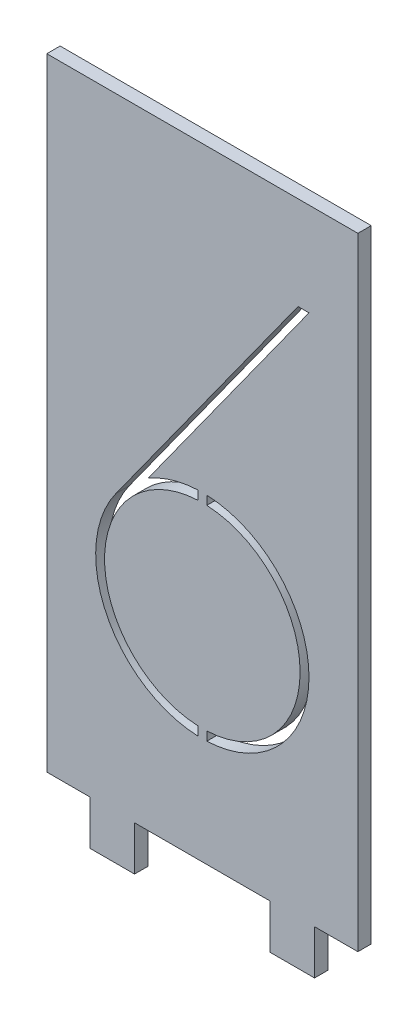
ISO-10303-21;
HEADER;
FILE_DESCRIPTION(('STEP AP214'),'2;1');
FILE_NAME('part.step','',(''),(''),'','','');
FILE_SCHEMA(('AUTOMOTIVE_DESIGN { 1 0 10303 214 1 1 1 1 }'));
ENDSEC;
DATA;
#1=APPLICATION_CONTEXT('core data for automotive mechanical design processes');
#2=APPLICATION_PROTOCOL_DEFINITION('international standard','automotive_design',2000,#1);
#3=PRODUCT_CONTEXT('',#1,'mechanical');
#4=PRODUCT('Part','Part','',(#3));
#5=PRODUCT_RELATED_PRODUCT_CATEGORY('part','',(#4));
#6=PRODUCT_DEFINITION_FORMATION('','',#4);
#7=PRODUCT_DEFINITION_CONTEXT('part definition',#1,'design');
#8=PRODUCT_DEFINITION('design','',#6,#7);
#9=PRODUCT_DEFINITION_SHAPE('','',#8);
#10=(LENGTH_UNIT() NAMED_UNIT(*) SI_UNIT(.MILLI.,.METRE.));
#11=(NAMED_UNIT(*) PLANE_ANGLE_UNIT() SI_UNIT($,.RADIAN.));
#12=(NAMED_UNIT(*) SI_UNIT($,.STERADIAN.) SOLID_ANGLE_UNIT());
#13=UNCERTAINTY_MEASURE_WITH_UNIT(LENGTH_MEASURE(1.E-05),#10,'distance_accuracy_value','');
#14=(GEOMETRIC_REPRESENTATION_CONTEXT(3) GLOBAL_UNCERTAINTY_ASSIGNED_CONTEXT((#13)) GLOBAL_UNIT_ASSIGNED_CONTEXT((#10,
#11,#12)) REPRESENTATION_CONTEXT('',''));
#15=CARTESIAN_POINT('',(0.,0.,0.));
#16=DIRECTION('',(0.,0.,1.));
#17=DIRECTION('',(1.,0.,0.));
#18=AXIS2_PLACEMENT_3D('',#15,#16,#17);
#19=CARTESIAN_POINT('',(17.,42.6431760717279,0.));
#20=DIRECTION('',(-1.,0.,0.));
#21=DIRECTION('',(0.,-1.,0.));
#22=AXIS2_PLACEMENT_3D('',#19,#20,#21);
#23=PLANE('',#22);
#24=DIRECTION('',(0.,0.,1.));
#25=VECTOR('',#24,1.);
#26=CARTESIAN_POINT('',(17.,18.011369512082,0.));
#27=LINE('',#26,#25);
#28=CARTESIAN_POINT('',(17.,18.011369512082,0.));
#29=VERTEX_POINT('',#28);
#30=CARTESIAN_POINT('',(17.,18.0113695120821,1.5));
#31=VERTEX_POINT('',#30);
#32=EDGE_CURVE('E237',#29,#31,#27,.T.);
#33=ORIENTED_EDGE('',*,*,#32,.F.);
#34=DIRECTION('',(0.,-1.,0.));
#35=VECTOR('',#34,1.);
#36=CARTESIAN_POINT('',(17.,42.6431760717279,0.));
#37=LINE('',#36,#35);
#38=CARTESIAN_POINT('',(17.,17.0104211917182,0.));
#39=VERTEX_POINT('',#38);
#40=EDGE_CURVE('E232',#29,#39,#37,.T.);
#41=ORIENTED_EDGE('',*,*,#40,.T.);
#42=DIRECTION('',(0.,0.,1.));
#43=VECTOR('',#42,1.);
#44=CARTESIAN_POINT('',(17.,17.0104211917182,0.));
#45=LINE('',#44,#43);
#46=CARTESIAN_POINT('',(17.,17.0104211917182,1.5));
#47=VERTEX_POINT('',#46);
#48=EDGE_CURVE('E396',#47,#39,#45,.F.);
#49=ORIENTED_EDGE('',*,*,#48,.F.);
#50=DIRECTION('',(0.,-1.,0.));
#51=VECTOR('',#50,1.);
#52=CARTESIAN_POINT('',(17.,42.6431760717279,1.5));
#53=LINE('',#52,#51);
#54=EDGE_CURVE('E260',#31,#47,#53,.T.);
#55=ORIENTED_EDGE('',*,*,#54,.F.);
#56=EDGE_LOOP('',(#33,#41,#49,#55));
#57=FACE_BOUND('',#56,.T.);
#58=ADVANCED_FACE('F38',(#57),#23,.T.);
#59=CARTESIAN_POINT('',(18.,42.6431760717279,0.));
#60=DIRECTION('',(1.,0.,0.));
#61=DIRECTION('',(0.,1.,0.));
#62=AXIS2_PLACEMENT_3D('',#59,#60,#61);
#63=PLANE('',#62);
#64=DIRECTION('',(0.,0.,1.));
#65=VECTOR('',#64,1.);
#66=CARTESIAN_POINT('',(18.,39.988630487918,0.));
#67=LINE('',#66,#65);
#68=CARTESIAN_POINT('',(18.,39.988630487918,0.));
#69=VERTEX_POINT('',#68);
#70=CARTESIAN_POINT('',(18.,39.988630487918,1.5));
#71=VERTEX_POINT('',#70);
#72=EDGE_CURVE('E11',#69,#71,#67,.T.);
#73=ORIENTED_EDGE('',*,*,#72,.F.);
#74=DIRECTION('',(0.,1.,0.));
#75=VECTOR('',#74,1.);
#76=CARTESIAN_POINT('',(18.,42.6431760717279,0.));
#77=LINE('',#76,#75);
#78=CARTESIAN_POINT('',(18.,40.9895788082818,0.));
#79=VERTEX_POINT('',#78);
#80=EDGE_CURVE('E410',#69,#79,#77,.T.);
#81=ORIENTED_EDGE('',*,*,#80,.T.);
#82=DIRECTION('',(0.,0.,1.));
#83=VECTOR('',#82,1.);
#84=CARTESIAN_POINT('',(18.,40.9895788082818,0.));
#85=LINE('',#84,#83);
#86=CARTESIAN_POINT('',(18.,40.9895788082818,1.5));
#87=VERTEX_POINT('',#86);
#88=EDGE_CURVE('E391',#87,#79,#85,.F.);
#89=ORIENTED_EDGE('',*,*,#88,.F.);
#90=DIRECTION('',(0.,1.,0.));
#91=VECTOR('',#90,1.);
#92=CARTESIAN_POINT('',(18.,42.6431760717279,1.5));
#93=LINE('',#92,#91);
#94=EDGE_CURVE('E259',#71,#87,#93,.T.);
#95=ORIENTED_EDGE('',*,*,#94,.F.);
#96=EDGE_LOOP('',(#73,#81,#89,#95));
#97=FACE_BOUND('',#96,.T.);
#98=ADVANCED_FACE('F441',(#97),#63,.T.);
#99=CARTESIAN_POINT('',(17.5,29.,0.));
#100=DIRECTION('',(0.,0.,1.));
#101=DIRECTION('',(1.,0.,0.));
#102=AXIS2_PLACEMENT_3D('',#99,#100,#101);
#103=CYLINDRICAL_SURFACE('',#102,12.);
#104=CARTESIAN_POINT('',(17.5,29.,0.));
#105=DIRECTION('',(0.,0.,1.));
#106=DIRECTION('',(1.,0.,0.));
#107=AXIS2_PLACEMENT_3D('',#104,#105,#106);
#108=CIRCLE('',#107,12.);
#109=CARTESIAN_POINT('',(17.,40.9895788082818,0.));
#110=VERTEX_POINT('',#109);
#111=CARTESIAN_POINT('',(11.39514276269,39.3310560017873,0.));
#112=VERTEX_POINT('',#111);
#113=EDGE_CURVE('E353',#110,#112,#108,.T.);
#114=ORIENTED_EDGE('',*,*,#113,.F.);
#115=DIRECTION('',(0.,0.,1.));
#116=VECTOR('',#115,1.);
#117=CARTESIAN_POINT('',(17.,40.9895788082818,0.));
#118=LINE('',#117,#116);
#119=CARTESIAN_POINT('',(17.,40.9895788082818,1.5));
#120=VERTEX_POINT('',#119);
#121=EDGE_CURVE('E394',#110,#120,#118,.T.);
#122=ORIENTED_EDGE('',*,*,#121,.T.);
#123=CARTESIAN_POINT('',(17.5,29.,1.5));
#124=DIRECTION('',(0.,0.,1.));
#125=DIRECTION('',(1.,0.,0.));
#126=AXIS2_PLACEMENT_3D('',#123,#124,#125);
#127=CIRCLE('',#126,12.);
#128=CARTESIAN_POINT('',(11.39514276269,39.3310560017873,1.5));
#129=VERTEX_POINT('',#128);
#130=EDGE_CURVE('E257',#120,#129,#127,.T.);
#131=ORIENTED_EDGE('',*,*,#130,.T.);
#132=DIRECTION('',(0.,0.,1.));
#133=VECTOR('',#132,1.);
#134=CARTESIAN_POINT('',(11.3951427626901,39.3310560017873,0.));
#135=LINE('',#134,#133);
#136=EDGE_CURVE('E382',#129,#112,#135,.F.);
#137=ORIENTED_EDGE('',*,*,#136,.T.);
#138=EDGE_LOOP('',(#114,#122,#131,#137));
#139=FACE_BOUND('',#138,.T.);
#140=ADVANCED_FACE('F436',(#139),#103,.F.);
#141=CARTESIAN_POINT('',(7.78741693441424,36.0473917298598,1.5));
#142=VERTEX_POINT('',#141);
#143=EDGE_CURVE('E379',#142,#47,#127,.T.);
#144=ORIENTED_EDGE('',*,*,#143,.T.);
#145=ORIENTED_EDGE('',*,*,#48,.T.);
#146=CARTESIAN_POINT('',(7.78741693441466,36.0473917298604,0.));
#147=VERTEX_POINT('',#146);
#148=EDGE_CURVE('E313',#147,#39,#108,.T.);
#149=ORIENTED_EDGE('',*,*,#148,.F.);
#150=DIRECTION('',(0.,0.,1.));
#151=VECTOR('',#150,1.);
#152=CARTESIAN_POINT('',(7.78741693441466,36.0473917298604,0.));
#153=LINE('',#152,#151);
#154=EDGE_CURVE('E278',#147,#142,#153,.T.);
#155=ORIENTED_EDGE('',*,*,#154,.T.);
#156=EDGE_LOOP('',(#144,#145,#149,#155));
#157=FACE_BOUND('',#156,.T.);
#158=ADVANCED_FACE('F422',(#157),#103,.F.);
#159=CARTESIAN_POINT('',(0.,0.,1.5));
#160=DIRECTION('',(0.,1.,0.));
#161=DIRECTION('',(0.,0.,1.));
#162=AXIS2_PLACEMENT_3D('',#159,#160,#161);
#163=PLANE('',#162);
#164=DIRECTION('',(1.,0.,0.));
#165=VECTOR('',#164,1.);
#166=CARTESIAN_POINT('',(0.,0.,1.5));
#167=LINE('',#166,#165);
#168=CARTESIAN_POINT('',(4.875,0.,1.5));
#169=VERTEX_POINT('',#168);
#170=CARTESIAN_POINT('',(9.875,0.,1.5));
#171=VERTEX_POINT('',#170);
#172=EDGE_CURVE('E326',#169,#171,#167,.T.);
#173=ORIENTED_EDGE('',*,*,#172,.F.);
#174=DIRECTION('',(0.,0.,1.));
#175=VECTOR('',#174,1.);
#176=CARTESIAN_POINT('',(4.875,0.,-18.5));
#177=LINE('',#176,#175);
#178=CARTESIAN_POINT('',(4.875,0.,0.));
#179=VERTEX_POINT('',#178);
#180=EDGE_CURVE('E295',#179,#169,#177,.T.);
#181=ORIENTED_EDGE('',*,*,#180,.F.);
#182=DIRECTION('',(1.,0.,0.));
#183=VECTOR('',#182,1.);
#184=CARTESIAN_POINT('',(0.,0.,0.));
#185=LINE('',#184,#183);
#186=CARTESIAN_POINT('',(9.875,0.,0.));
#187=VERTEX_POINT('',#186);
#188=EDGE_CURVE('E287',#179,#187,#185,.T.);
#189=ORIENTED_EDGE('',*,*,#188,.T.);
#190=DIRECTION('',(0.,0.,1.));
#191=VECTOR('',#190,1.);
#192=CARTESIAN_POINT('',(9.875,0.,-18.5));
#193=LINE('',#192,#191);
#194=EDGE_CURVE('E342',#187,#171,#193,.T.);
#195=ORIENTED_EDGE('',*,*,#194,.T.);
#196=EDGE_LOOP('',(#173,#181,#189,#195));
#197=FACE_BOUND('',#196,.T.);
#198=ADVANCED_FACE('F475',(#197),#163,.F.);
#199=CARTESIAN_POINT('',(0.,0.,1.5));
#200=DIRECTION('',(1.,0.,0.));
#201=DIRECTION('',(0.,1.,0.));
#202=AXIS2_PLACEMENT_3D('',#199,#200,#201);
#203=PLANE('',#202);
#204=DIRECTION('',(0.,-1.,0.));
#205=VECTOR('',#204,1.);
#206=CARTESIAN_POINT('',(0.,0.,0.));
#207=LINE('',#206,#205);
#208=CARTESIAN_POINT('',(0.,75.,0.));
#209=VERTEX_POINT('',#208);
#210=CARTESIAN_POINT('',(0.,5.,0.));
#211=VERTEX_POINT('',#210);
#212=EDGE_CURVE('E339',#209,#211,#207,.T.);
#213=ORIENTED_EDGE('',*,*,#212,.T.);
#214=DIRECTION('',(0.,0.,1.));
#215=VECTOR('',#214,1.);
#216=CARTESIAN_POINT('',(0.,5.,-18.5));
#217=LINE('',#216,#215);
#218=CARTESIAN_POINT('',(0.,5.,1.5));
#219=VERTEX_POINT('',#218);
#220=EDGE_CURVE('E332',#211,#219,#217,.T.);
#221=ORIENTED_EDGE('',*,*,#220,.T.);
#222=DIRECTION('',(0.,-1.,0.));
#223=VECTOR('',#222,1.);
#224=CARTESIAN_POINT('',(0.,0.,1.5));
#225=LINE('',#224,#223);
#226=CARTESIAN_POINT('',(0.,75.,1.5));
#227=VERTEX_POINT('',#226);
#228=EDGE_CURVE('E345',#227,#219,#225,.T.);
#229=ORIENTED_EDGE('',*,*,#228,.F.);
#230=DIRECTION('',(0.,0.,-1.));
#231=VECTOR('',#230,1.);
#232=CARTESIAN_POINT('',(0.,75.,1.5));
#233=LINE('',#232,#231);
#234=EDGE_CURVE('E328',#227,#209,#233,.T.);
#235=ORIENTED_EDGE('',*,*,#234,.T.);
#236=EDGE_LOOP('',(#213,#221,#229,#235));
#237=FACE_BOUND('',#236,.T.);
#238=ADVANCED_FACE('F471',(#237),#203,.F.);
#239=CARTESIAN_POINT('',(25.125,0.,0.));
#240=VERTEX_POINT('',#239);
#241=CARTESIAN_POINT('',(30.125,0.,0.));
#242=VERTEX_POINT('',#241);
#243=EDGE_CURVE('E331',#240,#242,#185,.T.);
#244=ORIENTED_EDGE('',*,*,#243,.T.);
#245=DIRECTION('',(0.,0.,1.));
#246=VECTOR('',#245,1.);
#247=CARTESIAN_POINT('',(30.125,0.,-18.5));
#248=LINE('',#247,#246);
#249=CARTESIAN_POINT('',(30.125,0.,1.5));
#250=VERTEX_POINT('',#249);
#251=EDGE_CURVE('E336',#242,#250,#248,.T.);
#252=ORIENTED_EDGE('',*,*,#251,.T.);
#253=CARTESIAN_POINT('',(25.125,0.,1.5));
#254=VERTEX_POINT('',#253);
#255=EDGE_CURVE('E348',#254,#250,#167,.T.);
#256=ORIENTED_EDGE('',*,*,#255,.F.);
#257=DIRECTION('',(0.,0.,1.));
#258=VECTOR('',#257,1.);
#259=CARTESIAN_POINT('',(25.125,0.,-18.5));
#260=LINE('',#259,#258);
#261=EDGE_CURVE('E321',#240,#254,#260,.T.);
#262=ORIENTED_EDGE('',*,*,#261,.F.);
#263=EDGE_LOOP('',(#244,#252,#256,#262));
#264=FACE_BOUND('',#263,.T.);
#265=ADVANCED_FACE('F474',(#264),#163,.F.);
#266=CARTESIAN_POINT('',(35.,0.,1.5));
#267=DIRECTION('',(-1.,0.,0.));
#268=DIRECTION('',(0.,-1.,0.));
#269=AXIS2_PLACEMENT_3D('',#266,#267,#268);
#270=PLANE('',#269);
#271=DIRECTION('',(0.,1.,0.));
#272=VECTOR('',#271,1.);
#273=CARTESIAN_POINT('',(35.,0.,1.5));
#274=LINE('',#273,#272);
#275=CARTESIAN_POINT('',(35.,5.,1.5));
#276=VERTEX_POINT('',#275);
#277=CARTESIAN_POINT('',(35.,75.,1.5));
#278=VERTEX_POINT('',#277);
#279=EDGE_CURVE('E346',#276,#278,#274,.T.);
#280=ORIENTED_EDGE('',*,*,#279,.F.);
#281=DIRECTION('',(0.,0.,1.));
#282=VECTOR('',#281,1.);
#283=CARTESIAN_POINT('',(35.,5.,-18.5));
#284=LINE('',#283,#282);
#285=CARTESIAN_POINT('',(35.,5.,0.));
#286=VERTEX_POINT('',#285);
#287=EDGE_CURVE('E308',#286,#276,#284,.T.);
#288=ORIENTED_EDGE('',*,*,#287,.F.);
#289=DIRECTION('',(0.,1.,0.));
#290=VECTOR('',#289,1.);
#291=CARTESIAN_POINT('',(35.,0.,0.));
#292=LINE('',#291,#290);
#293=CARTESIAN_POINT('',(35.,75.,0.));
#294=VERTEX_POINT('',#293);
#295=EDGE_CURVE('E334',#286,#294,#292,.T.);
#296=ORIENTED_EDGE('',*,*,#295,.T.);
#297=DIRECTION('',(0.,0.,-1.));
#298=VECTOR('',#297,1.);
#299=CARTESIAN_POINT('',(35.,75.,1.5));
#300=LINE('',#299,#298);
#301=EDGE_CURVE('E323',#278,#294,#300,.T.);
#302=ORIENTED_EDGE('',*,*,#301,.F.);
#303=EDGE_LOOP('',(#280,#288,#296,#302));
#304=FACE_BOUND('',#303,.T.);
#305=ADVANCED_FACE('F449',(#304),#270,.F.);
#306=CARTESIAN_POINT('',(0.,75.,1.5));
#307=DIRECTION('',(0.,-1.,0.));
#308=DIRECTION('',(0.,0.,-1.));
#309=AXIS2_PLACEMENT_3D('',#306,#307,#308);
#310=PLANE('',#309);
#311=DIRECTION('',(-1.,0.,0.));
#312=VECTOR('',#311,1.);
#313=CARTESIAN_POINT('',(0.,75.,0.));
#314=LINE('',#313,#312);
#315=EDGE_CURVE('E327',#294,#209,#314,.T.);
#316=ORIENTED_EDGE('',*,*,#315,.T.);
#317=ORIENTED_EDGE('',*,*,#234,.F.);
#318=DIRECTION('',(-1.,0.,0.));
#319=VECTOR('',#318,1.);
#320=CARTESIAN_POINT('',(0.,75.,1.5));
#321=LINE('',#320,#319);
#322=EDGE_CURVE('E343',#278,#227,#321,.T.);
#323=ORIENTED_EDGE('',*,*,#322,.F.);
#324=ORIENTED_EDGE('',*,*,#301,.T.);
#325=EDGE_LOOP('',(#316,#317,#323,#324));
#326=FACE_BOUND('',#325,.T.);
#327=ADVANCED_FACE('F443',(#326),#310,.F.);
#328=CARTESIAN_POINT('',(0.,0.,1.5));
#329=DIRECTION('',(0.,0.,-1.));
#330=DIRECTION('',(-1.,0.,0.));
#331=AXIS2_PLACEMENT_3D('',#328,#329,#330);
#332=PLANE('',#331);
#333=CARTESIAN_POINT('',(17.5,29.,1.5));
#334=DIRECTION('',(0.,0.,1.));
#335=DIRECTION('',(1.,0.,0.));
#336=AXIS2_PLACEMENT_3D('',#333,#334,#335);
#337=CIRCLE('',#336,11.);
#338=CARTESIAN_POINT('',(18.,18.011369512082,1.5));
#339=VERTEX_POINT('',#338);
#340=EDGE_CURVE('E61',#339,#71,#337,.T.);
#341=ORIENTED_EDGE('',*,*,#340,.T.);
#342=ORIENTED_EDGE('',*,*,#94,.T.);
#343=CARTESIAN_POINT('',(18.,17.0104211917182,1.5));
#344=VERTEX_POINT('',#343);
#345=EDGE_CURVE('E383',#344,#87,#127,.T.);
#346=ORIENTED_EDGE('',*,*,#345,.F.);
#347=EDGE_CURVE('E262',#344,#339,#93,.T.);
#348=ORIENTED_EDGE('',*,*,#347,.T.);
#349=EDGE_LOOP('',(#341,#342,#346,#348));
#350=FACE_BOUND('',#349,.T.);
#351=CARTESIAN_POINT('',(17.,39.988630487918,1.5));
#352=VERTEX_POINT('',#351);
#353=EDGE_CURVE('E252',#120,#352,#53,.T.);
#354=ORIENTED_EDGE('',*,*,#353,.T.);
#355=CARTESIAN_POINT('',(8.87097600846817,35.8220191258577,1.5));
#356=VERTEX_POINT('',#355);
#357=EDGE_CURVE('E242',#352,#356,#337,.T.);
#358=ORIENTED_EDGE('',*,*,#357,.T.);
#359=DIRECTION('',(0.583948178815754,0.811790936422528,0.));
#360=VECTOR('',#359,1.);
#361=CARTESIAN_POINT('',(29.5,64.5,1.5));
#362=LINE('',#361,#360);
#363=CARTESIAN_POINT('',(8.28802001640013,35.0116075039673,1.5));
#364=VERTEX_POINT('',#363);
#365=EDGE_CURVE('E221',#364,#356,#362,.T.);
#366=ORIENTED_EDGE('',*,*,#365,.F.);
#367=EDGE_CURVE('E53',#364,#31,#337,.T.);
#368=ORIENTED_EDGE('',*,*,#367,.T.);
#369=ORIENTED_EDGE('',*,*,#54,.T.);
#370=ORIENTED_EDGE('',*,*,#143,.F.);
#371=DIRECTION('',(-0.584208177449324,-0.811603847576722,0.));
#372=VECTOR('',#371,1.);
#373=CARTESIAN_POINT('',(28.268155746593,64.5,1.5));
#374=LINE('',#373,#372);
#375=CARTESIAN_POINT('',(28.268155746593,64.5,1.5));
#376=VERTEX_POINT('',#375);
#377=EDGE_CURVE('E279',#376,#142,#374,.T.);
#378=ORIENTED_EDGE('',*,*,#377,.F.);
#379=DIRECTION('',(-1.,0.,0.));
#380=VECTOR('',#379,1.);
#381=CARTESIAN_POINT('',(28.268155746593,64.5,1.5));
#382=LINE('',#381,#380);
#383=CARTESIAN_POINT('',(29.5,64.5,1.5));
#384=VERTEX_POINT('',#383);
#385=EDGE_CURVE('E272',#384,#376,#382,.T.);
#386=ORIENTED_EDGE('',*,*,#385,.F.);
#387=DIRECTION('',(0.583948178815754,0.811790936422528,0.));
#388=VECTOR('',#387,1.);
#389=CARTESIAN_POINT('',(29.5,64.5,1.5));
#390=LINE('',#389,#388);
#391=EDGE_CURVE('E281',#129,#384,#390,.T.);
#392=ORIENTED_EDGE('',*,*,#391,.F.);
#393=ORIENTED_EDGE('',*,*,#130,.F.);
#394=EDGE_LOOP('',(#354,#358,#366,#368,#369,#370,#378,#386,#392,#393));
#395=FACE_BOUND('',#394,.T.);
#396=DIRECTION('',(-1.,0.,0.));
#397=VECTOR('',#396,1.);
#398=CARTESIAN_POINT('',(4.875,5.,1.5));
#399=LINE('',#398,#397);
#400=CARTESIAN_POINT('',(4.875,5.,1.5));
#401=VERTEX_POINT('',#400);
#402=EDGE_CURVE('E365',#401,#219,#399,.T.);
#403=ORIENTED_EDGE('',*,*,#402,.F.);
#404=DIRECTION('',(0.,1.,0.));
#405=VECTOR('',#404,1.);
#406=CARTESIAN_POINT('',(4.875,5.,1.5));
#407=LINE('',#406,#405);
#408=EDGE_CURVE('E300',#169,#401,#407,.T.);
#409=ORIENTED_EDGE('',*,*,#408,.F.);
#410=ORIENTED_EDGE('',*,*,#172,.T.);
#411=DIRECTION('',(0.,-1.,0.));
#412=VECTOR('',#411,1.);
#413=CARTESIAN_POINT('',(9.875,0.,1.5));
#414=LINE('',#413,#412);
#415=CARTESIAN_POINT('',(9.875,5.,1.5));
#416=VERTEX_POINT('',#415);
#417=EDGE_CURVE('E318',#416,#171,#414,.T.);
#418=ORIENTED_EDGE('',*,*,#417,.F.);
#419=DIRECTION('',(-1.,0.,0.));
#420=VECTOR('',#419,1.);
#421=CARTESIAN_POINT('',(9.875,5.,1.5));
#422=LINE('',#421,#420);
#423=CARTESIAN_POINT('',(25.125,5.,1.5));
#424=VERTEX_POINT('',#423);
#425=EDGE_CURVE('E322',#424,#416,#422,.T.);
#426=ORIENTED_EDGE('',*,*,#425,.F.);
#427=DIRECTION('',(0.,1.,0.));
#428=VECTOR('',#427,1.);
#429=CARTESIAN_POINT('',(25.125,0.,1.5));
#430=LINE('',#429,#428);
#431=EDGE_CURVE('E305',#254,#424,#430,.T.);
#432=ORIENTED_EDGE('',*,*,#431,.F.);
#433=ORIENTED_EDGE('',*,*,#255,.T.);
#434=DIRECTION('',(0.,-1.,0.));
#435=VECTOR('',#434,1.);
#436=CARTESIAN_POINT('',(30.125,5.,1.5));
#437=LINE('',#436,#435);
#438=CARTESIAN_POINT('',(30.125,5.,1.5));
#439=VERTEX_POINT('',#438);
#440=EDGE_CURVE('E309',#439,#250,#437,.T.);
#441=ORIENTED_EDGE('',*,*,#440,.F.);
#442=DIRECTION('',(-1.,0.,0.));
#443=VECTOR('',#442,1.);
#444=CARTESIAN_POINT('',(30.125,5.,1.5));
#445=LINE('',#444,#443);
#446=EDGE_CURVE('E296',#276,#439,#445,.T.);
#447=ORIENTED_EDGE('',*,*,#446,.F.);
#448=ORIENTED_EDGE('',*,*,#279,.T.);
#449=ORIENTED_EDGE('',*,*,#322,.T.);
#450=ORIENTED_EDGE('',*,*,#228,.T.);
#451=EDGE_LOOP('',(#403,#409,#410,#418,#426,#432,#433,#441,#447,#448,#449,#450));
#452=FACE_BOUND('',#451,.T.);
#453=ADVANCED_FACE('F40',(#350,#395,#452),#332,.F.);
#454=CARTESIAN_POINT('',(0.,0.,0.));
#455=DIRECTION('',(0.,0.,-1.));
#456=DIRECTION('',(-1.,0.,0.));
#457=AXIS2_PLACEMENT_3D('',#454,#455,#456);
#458=PLANE('',#457);
#459=ORIENTED_EDGE('',*,*,#80,.F.);
#460=CARTESIAN_POINT('',(17.5,29.,0.));
#461=DIRECTION('',(0.,0.,1.));
#462=DIRECTION('',(1.,0.,0.));
#463=AXIS2_PLACEMENT_3D('',#460,#461,#462);
#464=CIRCLE('',#463,11.);
#465=CARTESIAN_POINT('',(18.,18.011369512082,0.));
#466=VERTEX_POINT('',#465);
#467=EDGE_CURVE('E234',#466,#69,#464,.T.);
#468=ORIENTED_EDGE('',*,*,#467,.F.);
#469=CARTESIAN_POINT('',(18.,17.0104211917182,0.));
#470=VERTEX_POINT('',#469);
#471=EDGE_CURVE('E265',#470,#466,#77,.T.);
#472=ORIENTED_EDGE('',*,*,#471,.F.);
#473=EDGE_CURVE('E385',#470,#79,#108,.T.);
#474=ORIENTED_EDGE('',*,*,#473,.T.);
#475=EDGE_LOOP('',(#459,#468,#472,#474));
#476=FACE_BOUND('',#475,.T.);
#477=CARTESIAN_POINT('',(17.,39.988630487918,0.));
#478=VERTEX_POINT('',#477);
#479=CARTESIAN_POINT('',(8.87097600846822,35.8220191258577,0.));
#480=VERTEX_POINT('',#479);
#481=EDGE_CURVE('E236',#478,#480,#464,.T.);
#482=ORIENTED_EDGE('',*,*,#481,.F.);
#483=EDGE_CURVE('E254',#110,#478,#37,.T.);
#484=ORIENTED_EDGE('',*,*,#483,.F.);
#485=ORIENTED_EDGE('',*,*,#113,.T.);
#486=DIRECTION('',(0.583948178815754,0.811790936422528,0.));
#487=VECTOR('',#486,1.);
#488=CARTESIAN_POINT('',(29.5,64.5,0.));
#489=LINE('',#488,#487);
#490=CARTESIAN_POINT('',(29.5,64.5,0.));
#491=VERTEX_POINT('',#490);
#492=EDGE_CURVE('E271',#112,#491,#489,.T.);
#493=ORIENTED_EDGE('',*,*,#492,.T.);
#494=DIRECTION('',(-1.,0.,0.));
#495=VECTOR('',#494,1.);
#496=CARTESIAN_POINT('',(28.268155746593,64.5,0.));
#497=LINE('',#496,#495);
#498=CARTESIAN_POINT('',(28.268155746593,64.5,0.));
#499=VERTEX_POINT('',#498);
#500=EDGE_CURVE('E275',#491,#499,#497,.T.);
#501=ORIENTED_EDGE('',*,*,#500,.T.);
#502=DIRECTION('',(-0.584208177449324,-0.811603847576722,0.));
#503=VECTOR('',#502,1.);
#504=CARTESIAN_POINT('',(28.268155746593,64.5,0.));
#505=LINE('',#504,#503);
#506=EDGE_CURVE('E268',#499,#147,#505,.T.);
#507=ORIENTED_EDGE('',*,*,#506,.T.);
#508=ORIENTED_EDGE('',*,*,#148,.T.);
#509=ORIENTED_EDGE('',*,*,#40,.F.);
#510=CARTESIAN_POINT('',(8.28802001640013,35.0116075039673,0.));
#511=VERTEX_POINT('',#510);
#512=EDGE_CURVE('E225',#511,#29,#464,.T.);
#513=ORIENTED_EDGE('',*,*,#512,.F.);
#514=DIRECTION('',(0.583948178815754,0.811790936422528,0.));
#515=VECTOR('',#514,1.);
#516=CARTESIAN_POINT('',(29.5,64.5,0.));
#517=LINE('',#516,#515);
#518=EDGE_CURVE('E211',#511,#480,#517,.T.);
#519=ORIENTED_EDGE('',*,*,#518,.T.);
#520=EDGE_LOOP('',(#482,#484,#485,#493,#501,#507,#508,#509,#513,#519));
#521=FACE_BOUND('',#520,.T.);
#522=DIRECTION('',(0.,-1.,0.));
#523=VECTOR('',#522,1.);
#524=CARTESIAN_POINT('',(4.875,0.,0.));
#525=LINE('',#524,#523);
#526=CARTESIAN_POINT('',(4.875,5.,0.));
#527=VERTEX_POINT('',#526);
#528=EDGE_CURVE('E293',#527,#179,#525,.T.);
#529=ORIENTED_EDGE('',*,*,#528,.F.);
#530=DIRECTION('',(1.,0.,0.));
#531=VECTOR('',#530,1.);
#532=CARTESIAN_POINT('',(0.,5.,0.));
#533=LINE('',#532,#531);
#534=EDGE_CURVE('E297',#211,#527,#533,.T.);
#535=ORIENTED_EDGE('',*,*,#534,.F.);
#536=ORIENTED_EDGE('',*,*,#212,.F.);
#537=ORIENTED_EDGE('',*,*,#315,.F.);
#538=ORIENTED_EDGE('',*,*,#295,.F.);
#539=DIRECTION('',(1.,0.,0.));
#540=VECTOR('',#539,1.);
#541=CARTESIAN_POINT('',(0.,5.,0.));
#542=LINE('',#541,#540);
#543=CARTESIAN_POINT('',(30.125,5.,0.));
#544=VERTEX_POINT('',#543);
#545=EDGE_CURVE('E306',#544,#286,#542,.T.);
#546=ORIENTED_EDGE('',*,*,#545,.F.);
#547=DIRECTION('',(0.,1.,0.));
#548=VECTOR('',#547,1.);
#549=CARTESIAN_POINT('',(30.125,0.,0.));
#550=LINE('',#549,#548);
#551=EDGE_CURVE('E301',#242,#544,#550,.T.);
#552=ORIENTED_EDGE('',*,*,#551,.F.);
#553=ORIENTED_EDGE('',*,*,#243,.F.);
#554=DIRECTION('',(0.,-1.,0.));
#555=VECTOR('',#554,1.);
#556=CARTESIAN_POINT('',(25.125,0.,0.));
#557=LINE('',#556,#555);
#558=CARTESIAN_POINT('',(25.125,5.,0.));
#559=VERTEX_POINT('',#558);
#560=EDGE_CURVE('E319',#559,#240,#557,.T.);
#561=ORIENTED_EDGE('',*,*,#560,.F.);
#562=DIRECTION('',(1.,0.,0.));
#563=VECTOR('',#562,1.);
#564=CARTESIAN_POINT('',(0.,5.,0.));
#565=LINE('',#564,#563);
#566=CARTESIAN_POINT('',(9.875,5.,0.));
#567=VERTEX_POINT('',#566);
#568=EDGE_CURVE('E314',#567,#559,#565,.T.);
#569=ORIENTED_EDGE('',*,*,#568,.F.);
#570=DIRECTION('',(0.,1.,0.));
#571=VECTOR('',#570,1.);
#572=CARTESIAN_POINT('',(9.875,0.,0.));
#573=LINE('',#572,#571);
#574=EDGE_CURVE('E310',#187,#567,#573,.T.);
#575=ORIENTED_EDGE('',*,*,#574,.F.);
#576=ORIENTED_EDGE('',*,*,#188,.F.);
#577=EDGE_LOOP('',(#529,#535,#536,#537,#538,#546,#552,#553,#561,#569,#575,#576));
#578=FACE_BOUND('',#577,.T.);
#579=ADVANCED_FACE('F229',(#476,#521,#578),#458,.T.);
#580=CARTESIAN_POINT('',(9.875,0.,-18.5));
#581=DIRECTION('',(-1.,0.,0.));
#582=DIRECTION('',(0.,-1.,0.));
#583=AXIS2_PLACEMENT_3D('',#580,#581,#582);
#584=PLANE('',#583);
#585=ORIENTED_EDGE('',*,*,#574,.T.);
#586=DIRECTION('',(0.,0.,1.));
#587=VECTOR('',#586,1.);
#588=CARTESIAN_POINT('',(9.875,5.,-18.5));
#589=LINE('',#588,#587);
#590=EDGE_CURVE('E312',#567,#416,#589,.T.);
#591=ORIENTED_EDGE('',*,*,#590,.T.);
#592=ORIENTED_EDGE('',*,*,#417,.T.);
#593=ORIENTED_EDGE('',*,*,#194,.F.);
#594=EDGE_LOOP('',(#585,#591,#592,#593));
#595=FACE_BOUND('',#594,.T.);
#596=ADVANCED_FACE('F448',(#595),#584,.F.);
#597=CARTESIAN_POINT('',(9.875,5.,-18.5));
#598=DIRECTION('',(0.,1.,0.));
#599=DIRECTION('',(0.,0.,1.));
#600=AXIS2_PLACEMENT_3D('',#597,#598,#599);
#601=PLANE('',#600);
#602=ORIENTED_EDGE('',*,*,#568,.T.);
#603=DIRECTION('',(0.,0.,1.));
#604=VECTOR('',#603,1.);
#605=CARTESIAN_POINT('',(25.125,5.,-18.5));
#606=LINE('',#605,#604);
#607=EDGE_CURVE('E317',#559,#424,#606,.T.);
#608=ORIENTED_EDGE('',*,*,#607,.T.);
#609=ORIENTED_EDGE('',*,*,#425,.T.);
#610=ORIENTED_EDGE('',*,*,#590,.F.);
#611=EDGE_LOOP('',(#602,#608,#609,#610));
#612=FACE_BOUND('',#611,.T.);
#613=ADVANCED_FACE('F485',(#612),#601,.F.);
#614=CARTESIAN_POINT('',(25.125,0.,-18.5));
#615=DIRECTION('',(1.,0.,0.));
#616=DIRECTION('',(0.,0.,-1.));
#617=AXIS2_PLACEMENT_3D('',#614,#615,#616);
#618=PLANE('',#617);
#619=ORIENTED_EDGE('',*,*,#560,.T.);
#620=ORIENTED_EDGE('',*,*,#261,.T.);
#621=ORIENTED_EDGE('',*,*,#431,.T.);
#622=ORIENTED_EDGE('',*,*,#607,.F.);
#623=EDGE_LOOP('',(#619,#620,#621,#622));
#624=FACE_BOUND('',#623,.T.);
#625=ADVANCED_FACE('F487',(#624),#618,.F.);
#626=CARTESIAN_POINT('',(30.125,5.,-18.5));
#627=DIRECTION('',(-1.,0.,0.));
#628=DIRECTION('',(0.,0.,1.));
#629=AXIS2_PLACEMENT_3D('',#626,#627,#628);
#630=PLANE('',#629);
#631=ORIENTED_EDGE('',*,*,#551,.T.);
#632=DIRECTION('',(0.,0.,1.));
#633=VECTOR('',#632,1.);
#634=CARTESIAN_POINT('',(30.125,5.,-18.5));
#635=LINE('',#634,#633);
#636=EDGE_CURVE('E304',#544,#439,#635,.T.);
#637=ORIENTED_EDGE('',*,*,#636,.T.);
#638=ORIENTED_EDGE('',*,*,#440,.T.);
#639=ORIENTED_EDGE('',*,*,#251,.F.);
#640=EDGE_LOOP('',(#631,#637,#638,#639));
#641=FACE_BOUND('',#640,.T.);
#642=ADVANCED_FACE('F490',(#641),#630,.F.);
#643=CARTESIAN_POINT('',(30.125,5.,-18.5));
#644=DIRECTION('',(0.,1.,0.));
#645=DIRECTION('',(0.,0.,1.));
#646=AXIS2_PLACEMENT_3D('',#643,#644,#645);
#647=PLANE('',#646);
#648=ORIENTED_EDGE('',*,*,#545,.T.);
#649=ORIENTED_EDGE('',*,*,#287,.T.);
#650=ORIENTED_EDGE('',*,*,#446,.T.);
#651=ORIENTED_EDGE('',*,*,#636,.F.);
#652=EDGE_LOOP('',(#648,#649,#650,#651));
#653=FACE_BOUND('',#652,.T.);
#654=ADVANCED_FACE('F499',(#653),#647,.F.);
#655=CARTESIAN_POINT('',(4.875,5.,-18.5));
#656=DIRECTION('',(1.,0.,0.));
#657=DIRECTION('',(0.,1.,0.));
#658=AXIS2_PLACEMENT_3D('',#655,#656,#657);
#659=PLANE('',#658);
#660=ORIENTED_EDGE('',*,*,#528,.T.);
#661=ORIENTED_EDGE('',*,*,#180,.T.);
#662=ORIENTED_EDGE('',*,*,#408,.T.);
#663=DIRECTION('',(0.,0.,1.));
#664=VECTOR('',#663,1.);
#665=CARTESIAN_POINT('',(4.875,5.,-18.5));
#666=LINE('',#665,#664);
#667=EDGE_CURVE('E299',#527,#401,#666,.T.);
#668=ORIENTED_EDGE('',*,*,#667,.F.);
#669=EDGE_LOOP('',(#660,#661,#662,#668));
#670=FACE_BOUND('',#669,.T.);
#671=ADVANCED_FACE('F495',(#670),#659,.F.);
#672=CARTESIAN_POINT('',(4.875,5.,-18.5));
#673=DIRECTION('',(0.,1.,0.));
#674=DIRECTION('',(-1.,0.,0.));
#675=AXIS2_PLACEMENT_3D('',#672,#673,#674);
#676=PLANE('',#675);
#677=ORIENTED_EDGE('',*,*,#534,.T.);
#678=ORIENTED_EDGE('',*,*,#667,.T.);
#679=ORIENTED_EDGE('',*,*,#402,.T.);
#680=ORIENTED_EDGE('',*,*,#220,.F.);
#681=EDGE_LOOP('',(#677,#678,#679,#680));
#682=FACE_BOUND('',#681,.T.);
#683=ADVANCED_FACE('F498',(#682),#676,.F.);
#684=ORIENTED_EDGE('',*,*,#345,.T.);
#685=ORIENTED_EDGE('',*,*,#88,.T.);
#686=ORIENTED_EDGE('',*,*,#473,.F.);
#687=DIRECTION('',(0.,0.,1.));
#688=VECTOR('',#687,1.);
#689=CARTESIAN_POINT('',(18.,17.0104211917182,0.));
#690=LINE('',#689,#688);
#691=EDGE_CURVE('E388',#470,#344,#690,.T.);
#692=ORIENTED_EDGE('',*,*,#691,.T.);
#693=EDGE_LOOP('',(#684,#685,#686,#692));
#694=FACE_BOUND('',#693,.T.);
#695=ADVANCED_FACE('F439',(#694),#103,.F.);
#696=CARTESIAN_POINT('',(29.5,64.5,0.));
#697=DIRECTION('',(0.811790936422528,-0.583948178815753,0.));
#698=DIRECTION('',(0.583948178815754,0.811790936422528,0.));
#699=AXIS2_PLACEMENT_3D('',#696,#697,#698);
#700=PLANE('',#699);
#701=ORIENTED_EDGE('',*,*,#391,.T.);
#702=DIRECTION('',(0.,0.,1.));
#703=VECTOR('',#702,1.);
#704=CARTESIAN_POINT('',(29.5,64.5,0.));
#705=LINE('',#704,#703);
#706=EDGE_CURVE('E288',#491,#384,#705,.T.);
#707=ORIENTED_EDGE('',*,*,#706,.F.);
#708=ORIENTED_EDGE('',*,*,#492,.F.);
#709=ORIENTED_EDGE('',*,*,#136,.F.);
#710=EDGE_LOOP('',(#701,#707,#708,#709));
#711=FACE_BOUND('',#710,.T.);
#712=ADVANCED_FACE('F434',(#711),#700,.F.);
#713=CARTESIAN_POINT('',(28.268155746593,64.5,0.));
#714=DIRECTION('',(-0.811603847576722,0.584208177449324,0.));
#715=DIRECTION('',(-0.584208177449324,-0.811603847576722,0.));
#716=AXIS2_PLACEMENT_3D('',#713,#714,#715);
#717=PLANE('',#716);
#718=ORIENTED_EDGE('',*,*,#377,.T.);
#719=ORIENTED_EDGE('',*,*,#154,.F.);
#720=ORIENTED_EDGE('',*,*,#506,.F.);
#721=DIRECTION('',(0.,0.,1.));
#722=VECTOR('',#721,1.);
#723=CARTESIAN_POINT('',(28.268155746593,64.5,0.));
#724=LINE('',#723,#722);
#725=EDGE_CURVE('E285',#499,#376,#724,.T.);
#726=ORIENTED_EDGE('',*,*,#725,.T.);
#727=EDGE_LOOP('',(#718,#719,#720,#726));
#728=FACE_BOUND('',#727,.T.);
#729=ADVANCED_FACE('F426',(#728),#717,.F.);
#730=CARTESIAN_POINT('',(28.268155746593,64.5,0.));
#731=DIRECTION('',(0.,1.,0.));
#732=DIRECTION('',(0.,0.,1.));
#733=AXIS2_PLACEMENT_3D('',#730,#731,#732);
#734=PLANE('',#733);
#735=ORIENTED_EDGE('',*,*,#385,.T.);
#736=ORIENTED_EDGE('',*,*,#725,.F.);
#737=ORIENTED_EDGE('',*,*,#500,.F.);
#738=ORIENTED_EDGE('',*,*,#706,.T.);
#739=EDGE_LOOP('',(#735,#736,#737,#738));
#740=FACE_BOUND('',#739,.T.);
#741=ADVANCED_FACE('F430',(#740),#734,.F.);
#742=DIRECTION('',(0.,0.,1.));
#743=VECTOR('',#742,1.);
#744=CARTESIAN_POINT('',(17.,39.988630487918,0.));
#745=LINE('',#744,#743);
#746=EDGE_CURVE('E233',#352,#478,#745,.F.);
#747=ORIENTED_EDGE('',*,*,#746,.F.);
#748=ORIENTED_EDGE('',*,*,#353,.F.);
#749=ORIENTED_EDGE('',*,*,#121,.F.);
#750=ORIENTED_EDGE('',*,*,#483,.T.);
#751=EDGE_LOOP('',(#747,#748,#749,#750));
#752=FACE_BOUND('',#751,.T.);
#753=ADVANCED_FACE('F250',(#752),#23,.T.);
#754=DIRECTION('',(0.,0.,1.));
#755=VECTOR('',#754,1.);
#756=CARTESIAN_POINT('',(18.,18.011369512082,0.));
#757=LINE('',#756,#755);
#758=EDGE_CURVE('E46',#339,#466,#757,.F.);
#759=ORIENTED_EDGE('',*,*,#758,.F.);
#760=ORIENTED_EDGE('',*,*,#347,.F.);
#761=ORIENTED_EDGE('',*,*,#691,.F.);
#762=ORIENTED_EDGE('',*,*,#471,.T.);
#763=EDGE_LOOP('',(#759,#760,#761,#762));
#764=FACE_BOUND('',#763,.T.);
#765=ADVANCED_FACE('F412',(#764),#63,.T.);
#766=CARTESIAN_POINT('',(17.5,29.,0.));
#767=DIRECTION('',(0.,0.,1.));
#768=DIRECTION('',(1.,0.,0.));
#769=AXIS2_PLACEMENT_3D('',#766,#767,#768);
#770=CYLINDRICAL_SURFACE('',#769,11.);
#771=ORIENTED_EDGE('',*,*,#467,.T.);
#772=ORIENTED_EDGE('',*,*,#72,.T.);
#773=ORIENTED_EDGE('',*,*,#340,.F.);
#774=ORIENTED_EDGE('',*,*,#758,.T.);
#775=EDGE_LOOP('',(#771,#772,#773,#774));
#776=FACE_BOUND('',#775,.T.);
#777=ADVANCED_FACE('F401',(#776),#770,.T.);
#778=ORIENTED_EDGE('',*,*,#357,.F.);
#779=ORIENTED_EDGE('',*,*,#746,.T.);
#780=ORIENTED_EDGE('',*,*,#481,.T.);
#781=DIRECTION('',(0.,0.,1.));
#782=VECTOR('',#781,1.);
#783=CARTESIAN_POINT('',(8.87097600846828,35.8220191258578,0.));
#784=LINE('',#783,#782);
#785=EDGE_CURVE('E217',#356,#480,#784,.F.);
#786=ORIENTED_EDGE('',*,*,#785,.F.);
#787=EDGE_LOOP('',(#778,#779,#780,#786));
#788=FACE_BOUND('',#787,.T.);
#789=ADVANCED_FACE('F245',(#788),#770,.T.);
#790=ORIENTED_EDGE('',*,*,#512,.T.);
#791=ORIENTED_EDGE('',*,*,#32,.T.);
#792=ORIENTED_EDGE('',*,*,#367,.F.);
#793=DIRECTION('',(0.,0.,1.));
#794=VECTOR('',#793,1.);
#795=CARTESIAN_POINT('',(8.28802001640013,35.0116075039673,0.));
#796=LINE('',#795,#794);
#797=EDGE_CURVE('E215',#511,#364,#796,.T.);
#798=ORIENTED_EDGE('',*,*,#797,.F.);
#799=EDGE_LOOP('',(#790,#791,#792,#798));
#800=FACE_BOUND('',#799,.T.);
#801=ADVANCED_FACE('F224',(#800),#770,.T.);
#802=CARTESIAN_POINT('',(29.5,64.5,0.));
#803=DIRECTION('',(0.811790936422528,-0.583948178815753,0.));
#804=DIRECTION('',(0.583948178815754,0.811790936422528,0.));
#805=AXIS2_PLACEMENT_3D('',#802,#803,#804);
#806=PLANE('',#805);
#807=ORIENTED_EDGE('',*,*,#785,.T.);
#808=ORIENTED_EDGE('',*,*,#518,.F.);
#809=ORIENTED_EDGE('',*,*,#797,.T.);
#810=ORIENTED_EDGE('',*,*,#365,.T.);
#811=EDGE_LOOP('',(#807,#808,#809,#810));
#812=FACE_BOUND('',#811,.T.);
#813=ADVANCED_FACE('F213',(#812),#806,.F.);
#814=CLOSED_SHELL('',(#58,#98,#140,#158,#198,#238,#265,#305,#327,#453,#579,#596,#613,#625,#642,
#654,#671,#683,#695,#712,#729,#741,#753,#765,#777,#789,#801,#813));
#815=MANIFOLD_SOLID_BREP('B2',#814);
#816=ADVANCED_BREP_SHAPE_REPRESENTATION('',(#18,#815),#14);
#817=SHAPE_DEFINITION_REPRESENTATION(#9,#816);
ENDSEC;
END-ISO-10303-21;
